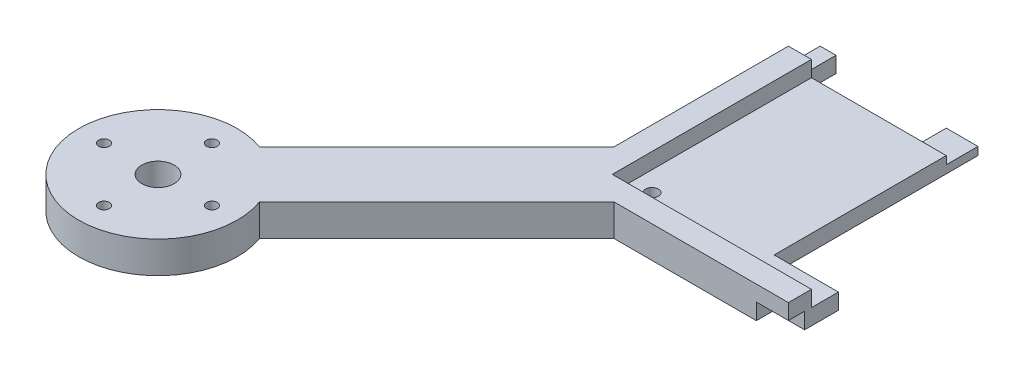
ISO-10303-21;
HEADER;
FILE_DESCRIPTION(('STEP AP214'),'2;1');
FILE_NAME('part.step','',(''),(''),'','','');
FILE_SCHEMA(('AUTOMOTIVE_DESIGN { 1 0 10303 214 1 1 1 1 }'));
ENDSEC;
DATA;
#1=APPLICATION_CONTEXT('core data for automotive mechanical design processes');
#2=APPLICATION_PROTOCOL_DEFINITION('international standard','automotive_design',2000,#1);
#3=PRODUCT_CONTEXT('',#1,'mechanical');
#4=PRODUCT('Part','Part','',(#3));
#5=PRODUCT_RELATED_PRODUCT_CATEGORY('part','',(#4));
#6=PRODUCT_DEFINITION_FORMATION('','',#4);
#7=PRODUCT_DEFINITION_CONTEXT('part definition',#1,'design');
#8=PRODUCT_DEFINITION('design','',#6,#7);
#9=PRODUCT_DEFINITION_SHAPE('','',#8);
#10=(LENGTH_UNIT() NAMED_UNIT(*) SI_UNIT(.MILLI.,.METRE.));
#11=(NAMED_UNIT(*) PLANE_ANGLE_UNIT() SI_UNIT($,.RADIAN.));
#12=(NAMED_UNIT(*) SI_UNIT($,.STERADIAN.) SOLID_ANGLE_UNIT());
#13=UNCERTAINTY_MEASURE_WITH_UNIT(LENGTH_MEASURE(1.E-05),#10,'distance_accuracy_value','');
#14=(GEOMETRIC_REPRESENTATION_CONTEXT(3) GLOBAL_UNCERTAINTY_ASSIGNED_CONTEXT((#13)) GLOBAL_UNIT_ASSIGNED_CONTEXT((#10,
#11,#12)) REPRESENTATION_CONTEXT('',''));
#15=CARTESIAN_POINT('',(0.,0.,0.));
#16=DIRECTION('',(0.,0.,1.));
#17=DIRECTION('',(1.,0.,0.));
#18=AXIS2_PLACEMENT_3D('',#15,#16,#17);
#19=CARTESIAN_POINT('',(-70.,-10.01,0.));
#20=DIRECTION('',(0.,0.,1.));
#21=DIRECTION('',(1.,0.,0.));
#22=AXIS2_PLACEMENT_3D('',#19,#20,#21);
#23=PLANE('',#22);
#24=DIRECTION('',(1.,0.,0.));
#25=VECTOR('',#24,1.);
#26=CARTESIAN_POINT('',(-70.,-5.,0.));
#27=LINE('',#26,#25);
#28=CARTESIAN_POINT('',(-70.,-5.,0.));
#29=VERTEX_POINT('',#28);
#30=CARTESIAN_POINT('',(-65.,-5.,0.));
#31=VERTEX_POINT('',#30);
#32=EDGE_CURVE('E230',#29,#31,#27,.T.);
#33=ORIENTED_EDGE('',*,*,#32,.F.);
#34=DIRECTION('',(0.,1.,0.));
#35=VECTOR('',#34,1.);
#36=CARTESIAN_POINT('',(-70.,-10.,0.));
#37=LINE('',#36,#35);
#38=CARTESIAN_POINT('',(-70.,0.,0.));
#39=VERTEX_POINT('',#38);
#40=EDGE_CURVE('E412',#29,#39,#37,.T.);
#41=ORIENTED_EDGE('',*,*,#40,.T.);
#42=DIRECTION('',(1.,0.,0.));
#43=VECTOR('',#42,1.);
#44=CARTESIAN_POINT('',(134.350288425444,0.,0.));
#45=LINE('',#44,#43);
#46=CARTESIAN_POINT('',(-62.75,0.,0.));
#47=VERTEX_POINT('',#46);
#48=EDGE_CURVE('E415',#39,#47,#45,.T.);
#49=ORIENTED_EDGE('',*,*,#48,.T.);
#50=DIRECTION('',(0.,1.,0.));
#51=VECTOR('',#50,1.);
#52=CARTESIAN_POINT('',(-62.75,-5.,0.));
#53=LINE('',#52,#51);
#54=CARTESIAN_POINT('',(-62.75,-5.,0.));
#55=VERTEX_POINT('',#54);
#56=EDGE_CURVE('E289',#55,#47,#53,.T.);
#57=ORIENTED_EDGE('',*,*,#56,.F.);
#58=DIRECTION('',(1.,0.,0.));
#59=VECTOR('',#58,1.);
#60=CARTESIAN_POINT('',(0.,-5.,0.));
#61=LINE('',#60,#59);
#62=CARTESIAN_POINT('',(-20.25,-5.,0.));
#63=VERTEX_POINT('',#62);
#64=EDGE_CURVE('E420',#55,#63,#61,.T.);
#65=ORIENTED_EDGE('',*,*,#64,.T.);
#66=DIRECTION('',(0.,1.,0.));
#67=VECTOR('',#66,1.);
#68=CARTESIAN_POINT('',(-20.25,-10.,0.));
#69=LINE('',#68,#67);
#70=CARTESIAN_POINT('',(-20.25,-7.5,0.));
#71=VERTEX_POINT('',#70);
#72=EDGE_CURVE('E285',#71,#63,#69,.T.);
#73=ORIENTED_EDGE('',*,*,#72,.F.);
#74=DIRECTION('',(1.,0.,0.));
#75=VECTOR('',#74,1.);
#76=CARTESIAN_POINT('',(-20.25,-7.5,0.));
#77=LINE('',#76,#75);
#78=CARTESIAN_POINT('',(-30.25,-7.5,0.));
#79=VERTEX_POINT('',#78);
#80=EDGE_CURVE('E250',#79,#71,#77,.T.);
#81=ORIENTED_EDGE('',*,*,#80,.F.);
#82=DIRECTION('',(0.,1.,0.));
#83=VECTOR('',#82,1.);
#84=CARTESIAN_POINT('',(-30.25,-10.,0.));
#85=LINE('',#84,#83);
#86=CARTESIAN_POINT('',(-30.25,-10.,0.));
#87=VERTEX_POINT('',#86);
#88=EDGE_CURVE('E244',#87,#79,#85,.T.);
#89=ORIENTED_EDGE('',*,*,#88,.F.);
#90=DIRECTION('',(1.,0.,0.));
#91=VECTOR('',#90,1.);
#92=CARTESIAN_POINT('',(134.350288425444,-10.,0.));
#93=LINE('',#92,#91);
#94=CARTESIAN_POINT('',(-65.,-10.,0.));
#95=VERTEX_POINT('',#94);
#96=EDGE_CURVE('E280',#95,#87,#93,.T.);
#97=ORIENTED_EDGE('',*,*,#96,.F.);
#98=DIRECTION('',(0.,-1.,0.));
#99=VECTOR('',#98,1.);
#100=CARTESIAN_POINT('',(-65.,-10.,0.));
#101=LINE('',#100,#99);
#102=EDGE_CURVE('E220',#31,#95,#101,.T.);
#103=ORIENTED_EDGE('',*,*,#102,.F.);
#104=EDGE_LOOP('',(#33,#41,#49,#57,#65,#73,#81,#89,#97,#103));
#105=FACE_BOUND('',#104,.T.);
#106=ADVANCED_FACE('F39',(#105),#23,.F.);
#107=CARTESIAN_POINT('',(0.,-10.01,-70.));
#108=DIRECTION('',(-1.,0.,0.));
#109=DIRECTION('',(0.,0.,1.));
#110=AXIS2_PLACEMENT_3D('',#107,#108,#109);
#111=PLANE('',#110);
#112=DIRECTION('',(0.,-1.,0.));
#113=VECTOR('',#112,1.);
#114=CARTESIAN_POINT('',(0.,-10.,70.));
#115=LINE('',#114,#113);
#116=CARTESIAN_POINT('',(0.,0.,70.));
#117=VERTEX_POINT('',#116);
#118=CARTESIAN_POINT('',(0.,-4.9,70.));
#119=VERTEX_POINT('',#118);
#120=EDGE_CURVE('E286',#117,#119,#115,.T.);
#121=ORIENTED_EDGE('',*,*,#120,.T.);
#122=DIRECTION('',(0.,0.,1.));
#123=VECTOR('',#122,1.);
#124=CARTESIAN_POINT('',(0.,-4.9,70.));
#125=LINE('',#124,#123);
#126=CARTESIAN_POINT('',(0.,-4.9,64.9));
#127=VERTEX_POINT('',#126);
#128=EDGE_CURVE('E459',#127,#119,#125,.T.);
#129=ORIENTED_EDGE('',*,*,#128,.F.);
#130=DIRECTION('',(0.,1.,0.));
#131=VECTOR('',#130,1.);
#132=CARTESIAN_POINT('',(0.,-10.,64.9));
#133=LINE('',#132,#131);
#134=CARTESIAN_POINT('',(0.,-10.,64.9));
#135=VERTEX_POINT('',#134);
#136=EDGE_CURVE('E462',#135,#127,#133,.T.);
#137=ORIENTED_EDGE('',*,*,#136,.F.);
#138=DIRECTION('',(0.,0.,1.));
#139=VECTOR('',#138,1.);
#140=CARTESIAN_POINT('',(0.,-10.,-134.350288425444));
#141=LINE('',#140,#139);
#142=CARTESIAN_POINT('',(0.,-10.,54.25));
#143=VERTEX_POINT('',#142);
#144=EDGE_CURVE('E205',#143,#135,#141,.T.);
#145=ORIENTED_EDGE('',*,*,#144,.F.);
#146=DIRECTION('',(0.,-1.,0.));
#147=VECTOR('',#146,1.);
#148=CARTESIAN_POINT('',(0.,-10.,54.25));
#149=LINE('',#148,#147);
#150=CARTESIAN_POINT('',(0.,-5.,54.25));
#151=VERTEX_POINT('',#150);
#152=EDGE_CURVE('E281',#151,#143,#149,.T.);
#153=ORIENTED_EDGE('',*,*,#152,.F.);
#154=DIRECTION('',(0.,0.,1.));
#155=VECTOR('',#154,1.);
#156=CARTESIAN_POINT('',(0.,-5.,0.));
#157=LINE('',#156,#155);
#158=CARTESIAN_POINT('',(0.,-5.,62.75));
#159=VERTEX_POINT('',#158);
#160=EDGE_CURVE('E42',#151,#159,#157,.T.);
#161=ORIENTED_EDGE('',*,*,#160,.T.);
#162=DIRECTION('',(0.,-1.,0.));
#163=VECTOR('',#162,1.);
#164=CARTESIAN_POINT('',(0.,-5.,62.75));
#165=LINE('',#164,#163);
#166=CARTESIAN_POINT('',(0.,0.,62.75));
#167=VERTEX_POINT('',#166);
#168=EDGE_CURVE('E279',#167,#159,#165,.T.);
#169=ORIENTED_EDGE('',*,*,#168,.F.);
#170=DIRECTION('',(0.,0.,1.));
#171=VECTOR('',#170,1.);
#172=CARTESIAN_POINT('',(0.,0.,-134.350288425444));
#173=LINE('',#172,#171);
#174=EDGE_CURVE('E419',#167,#117,#173,.T.);
#175=ORIENTED_EDGE('',*,*,#174,.T.);
#176=EDGE_LOOP('',(#121,#129,#137,#145,#153,#161,#169,#175));
#177=FACE_BOUND('',#176,.T.);
#178=ADVANCED_FACE('F443',(#177),#111,.F.);
#179=CARTESIAN_POINT('',(-134.350288425444,-10.,117.350288425444));
#180=DIRECTION('',(0.,1.,0.));
#181=DIRECTION('',(0.,0.,1.));
#182=AXIS2_PLACEMENT_3D('',#179,#180,#181);
#183=CYLINDRICAL_SURFACE('',#182,1.70000000000001);
#184=CARTESIAN_POINT('',(-134.350288425444,-10.,117.350288425444));
#185=DIRECTION('',(0.,1.,0.));
#186=DIRECTION('',(0.,0.,1.));
#187=AXIS2_PLACEMENT_3D('',#184,#185,#186);
#188=CIRCLE('',#187,1.70000000000001);
#189=CARTESIAN_POINT('',(-134.350288425444,-10.,119.050288425444));
#190=VERTEX_POINT('',#189);
#191=EDGE_CURVE('E348',#190,#190,#188,.T.);
#192=ORIENTED_EDGE('',*,*,#191,.F.);
#193=EDGE_LOOP('',(#192));
#194=FACE_BOUND('',#193,.T.);
#195=CARTESIAN_POINT('',(-134.350288425444,0.,117.350288425444));
#196=DIRECTION('',(0.,1.,0.));
#197=DIRECTION('',(0.,0.,1.));
#198=AXIS2_PLACEMENT_3D('',#195,#196,#197);
#199=CIRCLE('',#198,1.70000000000001);
#200=CARTESIAN_POINT('',(-134.350288425444,0.,119.050288425444));
#201=VERTEX_POINT('',#200);
#202=EDGE_CURVE('E349',#201,#201,#199,.T.);
#203=ORIENTED_EDGE('',*,*,#202,.T.);
#204=EDGE_LOOP('',(#203));
#205=FACE_BOUND('',#204,.T.);
#206=ADVANCED_FACE('F484',(#194,#205),#183,.F.);
#207=CARTESIAN_POINT('',(-117.350288425444,-10.,134.350288425444));
#208=DIRECTION('',(0.,1.,0.));
#209=DIRECTION('',(0.,0.,1.));
#210=AXIS2_PLACEMENT_3D('',#207,#208,#209);
#211=CYLINDRICAL_SURFACE('',#210,1.7);
#212=CARTESIAN_POINT('',(-117.350288425444,-10.,134.350288425444));
#213=DIRECTION('',(0.,1.,0.));
#214=DIRECTION('',(0.,0.,1.));
#215=AXIS2_PLACEMENT_3D('',#212,#213,#214);
#216=CIRCLE('',#215,1.7);
#217=CARTESIAN_POINT('',(-117.350288425444,-10.,136.050288425444));
#218=VERTEX_POINT('',#217);
#219=EDGE_CURVE('E353',#218,#218,#216,.T.);
#220=ORIENTED_EDGE('',*,*,#219,.F.);
#221=EDGE_LOOP('',(#220));
#222=FACE_BOUND('',#221,.T.);
#223=CARTESIAN_POINT('',(-117.350288425444,0.,134.350288425444));
#224=DIRECTION('',(0.,1.,0.));
#225=DIRECTION('',(0.,0.,1.));
#226=AXIS2_PLACEMENT_3D('',#223,#224,#225);
#227=CIRCLE('',#226,1.7);
#228=CARTESIAN_POINT('',(-117.350288425444,0.,136.050288425444));
#229=VERTEX_POINT('',#228);
#230=EDGE_CURVE('E357',#229,#229,#227,.T.);
#231=ORIENTED_EDGE('',*,*,#230,.T.);
#232=EDGE_LOOP('',(#231));
#233=FACE_BOUND('',#232,.T.);
#234=ADVANCED_FACE('F542',(#222,#233),#211,.F.);
#235=CARTESIAN_POINT('',(-151.350288425444,-10.,134.350288425444));
#236=DIRECTION('',(0.,1.,0.));
#237=DIRECTION('',(0.,0.,1.));
#238=AXIS2_PLACEMENT_3D('',#235,#236,#237);
#239=CYLINDRICAL_SURFACE('',#238,1.70000000000001);
#240=CARTESIAN_POINT('',(-151.350288425444,-10.,134.350288425444));
#241=DIRECTION('',(0.,1.,0.));
#242=DIRECTION('',(0.,0.,1.));
#243=AXIS2_PLACEMENT_3D('',#240,#241,#242);
#244=CIRCLE('',#243,1.70000000000001);
#245=CARTESIAN_POINT('',(-151.350288425444,-10.,136.050288425444));
#246=VERTEX_POINT('',#245);
#247=EDGE_CURVE('E361',#246,#246,#244,.T.);
#248=ORIENTED_EDGE('',*,*,#247,.F.);
#249=EDGE_LOOP('',(#248));
#250=FACE_BOUND('',#249,.T.);
#251=CARTESIAN_POINT('',(-151.350288425444,0.,134.350288425444));
#252=DIRECTION('',(0.,1.,0.));
#253=DIRECTION('',(0.,0.,1.));
#254=AXIS2_PLACEMENT_3D('',#251,#252,#253);
#255=CIRCLE('',#254,1.70000000000001);
#256=CARTESIAN_POINT('',(-151.350288425444,0.,136.050288425444));
#257=VERTEX_POINT('',#256);
#258=EDGE_CURVE('E365',#257,#257,#255,.T.);
#259=ORIENTED_EDGE('',*,*,#258,.T.);
#260=EDGE_LOOP('',(#259));
#261=FACE_BOUND('',#260,.T.);
#262=ADVANCED_FACE('F548',(#250,#261),#239,.F.);
#263=CARTESIAN_POINT('',(-134.350288425444,-10.,151.350288425444));
#264=DIRECTION('',(0.,1.,0.));
#265=DIRECTION('',(0.,0.,1.));
#266=AXIS2_PLACEMENT_3D('',#263,#264,#265);
#267=CYLINDRICAL_SURFACE('',#266,1.70000000000001);
#268=CARTESIAN_POINT('',(-134.350288425444,-10.,151.350288425444));
#269=DIRECTION('',(0.,1.,0.));
#270=DIRECTION('',(0.,0.,1.));
#271=AXIS2_PLACEMENT_3D('',#268,#269,#270);
#272=CIRCLE('',#271,1.70000000000001);
#273=CARTESIAN_POINT('',(-134.350288425444,-10.,153.050288425444));
#274=VERTEX_POINT('',#273);
#275=EDGE_CURVE('E369',#274,#274,#272,.T.);
#276=ORIENTED_EDGE('',*,*,#275,.F.);
#277=EDGE_LOOP('',(#276));
#278=FACE_BOUND('',#277,.T.);
#279=CARTESIAN_POINT('',(-134.350288425444,0.,151.350288425444));
#280=DIRECTION('',(0.,1.,0.));
#281=DIRECTION('',(0.,0.,1.));
#282=AXIS2_PLACEMENT_3D('',#279,#280,#281);
#283=CIRCLE('',#282,1.70000000000001);
#284=CARTESIAN_POINT('',(-134.350288425444,0.,153.050288425444));
#285=VERTEX_POINT('',#284);
#286=EDGE_CURVE('E373',#285,#285,#283,.T.);
#287=ORIENTED_EDGE('',*,*,#286,.T.);
#288=EDGE_LOOP('',(#287));
#289=FACE_BOUND('',#288,.T.);
#290=ADVANCED_FACE('F559',(#278,#289),#267,.F.);
#291=CARTESIAN_POINT('',(-134.350288425444,-10.,134.350288425444));
#292=DIRECTION('',(0.,1.,0.));
#293=DIRECTION('',(0.,0.,1.));
#294=AXIS2_PLACEMENT_3D('',#291,#292,#293);
#295=CYLINDRICAL_SURFACE('',#294,5.10000000000065);
#296=CARTESIAN_POINT('',(-134.350288425444,-10.,134.350288425444));
#297=DIRECTION('',(0.,1.,0.));
#298=DIRECTION('',(0.,0.,1.));
#299=AXIS2_PLACEMENT_3D('',#296,#297,#298);
#300=CIRCLE('',#299,5.10000000000065);
#301=CARTESIAN_POINT('',(-134.350288425444,-10.,139.450288425445));
#302=VERTEX_POINT('',#301);
#303=EDGE_CURVE('E377',#302,#302,#300,.T.);
#304=ORIENTED_EDGE('',*,*,#303,.F.);
#305=EDGE_LOOP('',(#304));
#306=FACE_BOUND('',#305,.T.);
#307=CARTESIAN_POINT('',(-134.350288425444,0.,134.350288425444));
#308=DIRECTION('',(0.,1.,0.));
#309=DIRECTION('',(0.,0.,1.));
#310=AXIS2_PLACEMENT_3D('',#307,#308,#309);
#311=CIRCLE('',#310,5.10000000000065);
#312=CARTESIAN_POINT('',(-134.350288425444,0.,139.450288425445));
#313=VERTEX_POINT('',#312);
#314=EDGE_CURVE('E381',#313,#313,#311,.T.);
#315=ORIENTED_EDGE('',*,*,#314,.T.);
#316=EDGE_LOOP('',(#315));
#317=FACE_BOUND('',#316,.T.);
#318=ADVANCED_FACE('F563',(#306,#317),#295,.F.);
#319=CARTESIAN_POINT('',(-55.,-10.,70.));
#320=DIRECTION('',(0.,0.,1.));
#321=DIRECTION('',(1.,0.,0.));
#322=AXIS2_PLACEMENT_3D('',#319,#320,#321);
#323=PLANE('',#322);
#324=DIRECTION('',(1.,0.,0.));
#325=VECTOR('',#324,1.);
#326=CARTESIAN_POINT('',(-10.1,-4.9,70.));
#327=LINE('',#326,#325);
#328=CARTESIAN_POINT('',(-10.1,-4.9,70.));
#329=VERTEX_POINT('',#328);
#330=EDGE_CURVE('E210',#329,#119,#327,.T.);
#331=ORIENTED_EDGE('',*,*,#330,.T.);
#332=ORIENTED_EDGE('',*,*,#120,.F.);
#333=DIRECTION('',(1.,0.,0.));
#334=VECTOR('',#333,1.);
#335=CARTESIAN_POINT('',(-55.,0.,70.));
#336=LINE('',#335,#334);
#337=CARTESIAN_POINT('',(-55.,0.,70.));
#338=VERTEX_POINT('',#337);
#339=EDGE_CURVE('E304',#338,#117,#336,.T.);
#340=ORIENTED_EDGE('',*,*,#339,.F.);
#341=DIRECTION('',(0.,1.,0.));
#342=VECTOR('',#341,1.);
#343=CARTESIAN_POINT('',(-55.,-10.,70.));
#344=LINE('',#343,#342);
#345=CARTESIAN_POINT('',(-55.,-10.,70.));
#346=VERTEX_POINT('',#345);
#347=EDGE_CURVE('E301',#346,#338,#344,.T.);
#348=ORIENTED_EDGE('',*,*,#347,.F.);
#349=DIRECTION('',(1.,0.,0.));
#350=VECTOR('',#349,1.);
#351=CARTESIAN_POINT('',(-55.,-10.,70.));
#352=LINE('',#351,#350);
#353=CARTESIAN_POINT('',(-10.1,-10.,70.));
#354=VERTEX_POINT('',#353);
#355=EDGE_CURVE('E294',#346,#354,#352,.T.);
#356=ORIENTED_EDGE('',*,*,#355,.T.);
#357=DIRECTION('',(0.,-1.,0.));
#358=VECTOR('',#357,1.);
#359=CARTESIAN_POINT('',(-10.1,-10.,70.));
#360=LINE('',#359,#358);
#361=EDGE_CURVE('E56',#329,#354,#360,.T.);
#362=ORIENTED_EDGE('',*,*,#361,.F.);
#363=EDGE_LOOP('',(#331,#332,#340,#348,#356,#362));
#364=FACE_BOUND('',#363,.T.);
#365=ADVANCED_FACE('F455',(#364),#323,.T.);
#366=CARTESIAN_POINT('',(-55.,-10.,70.));
#367=DIRECTION('',(0.707106781186547,0.,0.707106781186548));
#368=DIRECTION('',(0.707106781186548,0.,-0.707106781186547));
#369=AXIS2_PLACEMENT_3D('',#366,#367,#368);
#370=PLANE('',#369);
#371=DIRECTION('',(0.707106781186548,0.,-0.707106781186547));
#372=VECTOR('',#371,1.);
#373=CARTESIAN_POINT('',(-55.,0.,70.));
#374=LINE('',#373,#372);
#375=CARTESIAN_POINT('',(-110.842477831862,0.,125.842477831862));
#376=VERTEX_POINT('',#375);
#377=EDGE_CURVE('E308',#376,#338,#374,.T.);
#378=ORIENTED_EDGE('',*,*,#377,.F.);
#379=DIRECTION('',(0.,1.,0.));
#380=VECTOR('',#379,1.);
#381=CARTESIAN_POINT('',(-110.842477831862,-10.,125.842477831862));
#382=LINE('',#381,#380);
#383=CARTESIAN_POINT('',(-110.842477831862,-10.,125.842477831862));
#384=VERTEX_POINT('',#383);
#385=EDGE_CURVE('E298',#384,#376,#382,.T.);
#386=ORIENTED_EDGE('',*,*,#385,.F.);
#387=DIRECTION('',(0.707106781186548,0.,-0.707106781186547));
#388=VECTOR('',#387,1.);
#389=CARTESIAN_POINT('',(-55.,-10.,70.));
#390=LINE('',#389,#388);
#391=EDGE_CURVE('E324',#384,#346,#390,.T.);
#392=ORIENTED_EDGE('',*,*,#391,.T.);
#393=ORIENTED_EDGE('',*,*,#347,.T.);
#394=EDGE_LOOP('',(#378,#386,#392,#393));
#395=FACE_BOUND('',#394,.T.);
#396=ADVANCED_FACE('F725',(#395),#370,.T.);
#397=CARTESIAN_POINT('',(-134.350288425444,-10.,134.350288425444));
#398=DIRECTION('',(0.,1.,0.));
#399=DIRECTION('',(0.,0.,1.));
#400=AXIS2_PLACEMENT_3D('',#397,#398,#399);
#401=CYLINDRICAL_SURFACE('',#400,25.);
#402=CARTESIAN_POINT('',(-134.350288425444,0.,134.350288425444));
#403=DIRECTION('',(0.,1.,0.));
#404=DIRECTION('',(0.,0.,1.));
#405=AXIS2_PLACEMENT_3D('',#402,#403,#404);
#406=CIRCLE('',#405,25.);
#407=CARTESIAN_POINT('',(-125.842477831862,0.,110.842477831862));
#408=VERTEX_POINT('',#407);
#409=EDGE_CURVE('E313',#408,#376,#406,.T.);
#410=ORIENTED_EDGE('',*,*,#409,.F.);
#411=DIRECTION('',(0.,1.,0.));
#412=VECTOR('',#411,1.);
#413=CARTESIAN_POINT('',(-125.842477831862,-10.,110.842477831862));
#414=LINE('',#413,#412);
#415=CARTESIAN_POINT('',(-125.842477831862,-10.,110.842477831862));
#416=VERTEX_POINT('',#415);
#417=EDGE_CURVE('E295',#416,#408,#414,.T.);
#418=ORIENTED_EDGE('',*,*,#417,.F.);
#419=CARTESIAN_POINT('',(-134.350288425444,-10.,134.350288425444));
#420=DIRECTION('',(0.,1.,0.));
#421=DIRECTION('',(0.,0.,1.));
#422=AXIS2_PLACEMENT_3D('',#419,#420,#421);
#423=CIRCLE('',#422,25.);
#424=EDGE_CURVE('E328',#416,#384,#423,.T.);
#425=ORIENTED_EDGE('',*,*,#424,.T.);
#426=ORIENTED_EDGE('',*,*,#385,.T.);
#427=EDGE_LOOP('',(#410,#418,#425,#426));
#428=FACE_BOUND('',#427,.T.);
#429=ADVANCED_FACE('F717',(#428),#401,.T.);
#430=CARTESIAN_POINT('',(-70.,-10.,55.));
#431=DIRECTION('',(-0.707106781186548,0.,-0.707106781186547));
#432=DIRECTION('',(-0.707106781186547,0.,0.707106781186548));
#433=AXIS2_PLACEMENT_3D('',#430,#431,#432);
#434=PLANE('',#433);
#435=DIRECTION('',(-0.707106781186547,0.,0.707106781186548));
#436=VECTOR('',#435,1.);
#437=CARTESIAN_POINT('',(-70.,0.,55.));
#438=LINE('',#437,#436);
#439=CARTESIAN_POINT('',(-70.,0.,55.));
#440=VERTEX_POINT('',#439);
#441=EDGE_CURVE('E317',#440,#408,#438,.T.);
#442=ORIENTED_EDGE('',*,*,#441,.F.);
#443=DIRECTION('',(0.,1.,0.));
#444=VECTOR('',#443,1.);
#445=CARTESIAN_POINT('',(-70.,-10.,55.));
#446=LINE('',#445,#444);
#447=CARTESIAN_POINT('',(-70.,-10.,55.));
#448=VERTEX_POINT('',#447);
#449=EDGE_CURVE('E290',#448,#440,#446,.T.);
#450=ORIENTED_EDGE('',*,*,#449,.F.);
#451=DIRECTION('',(-0.707106781186547,0.,0.707106781186548));
#452=VECTOR('',#451,1.);
#453=CARTESIAN_POINT('',(-70.,-10.,55.));
#454=LINE('',#453,#452);
#455=EDGE_CURVE('E332',#448,#416,#454,.T.);
#456=ORIENTED_EDGE('',*,*,#455,.T.);
#457=ORIENTED_EDGE('',*,*,#417,.T.);
#458=EDGE_LOOP('',(#442,#450,#456,#457));
#459=FACE_BOUND('',#458,.T.);
#460=ADVANCED_FACE('F574',(#459),#434,.T.);
#461=CARTESIAN_POINT('',(-70.,-10.,-55.));
#462=DIRECTION('',(-1.,0.,0.));
#463=DIRECTION('',(0.,0.,1.));
#464=AXIS2_PLACEMENT_3D('',#461,#462,#463);
#465=PLANE('',#464);
#466=ORIENTED_EDGE('',*,*,#40,.F.);
#467=DIRECTION('',(0.,0.,1.));
#468=VECTOR('',#467,1.);
#469=CARTESIAN_POINT('',(-70.,-5.,-10.));
#470=LINE('',#469,#468);
#471=CARTESIAN_POINT('',(-70.,-5.,-10.));
#472=VERTEX_POINT('',#471);
#473=EDGE_CURVE('E241',#472,#29,#470,.T.);
#474=ORIENTED_EDGE('',*,*,#473,.F.);
#475=DIRECTION('',(0.,1.,0.));
#476=VECTOR('',#475,1.);
#477=CARTESIAN_POINT('',(-70.,-10.,-10.));
#478=LINE('',#477,#476);
#479=CARTESIAN_POINT('',(-70.,-10.,-10.));
#480=VERTEX_POINT('',#479);
#481=EDGE_CURVE('E215',#480,#472,#478,.T.);
#482=ORIENTED_EDGE('',*,*,#481,.F.);
#483=DIRECTION('',(0.,0.,1.));
#484=VECTOR('',#483,1.);
#485=CARTESIAN_POINT('',(-70.,-10.,-55.));
#486=LINE('',#485,#484);
#487=EDGE_CURVE('E309',#480,#448,#486,.T.);
#488=ORIENTED_EDGE('',*,*,#487,.T.);
#489=ORIENTED_EDGE('',*,*,#449,.T.);
#490=DIRECTION('',(0.,0.,1.));
#491=VECTOR('',#490,1.);
#492=CARTESIAN_POINT('',(-70.,0.,-55.));
#493=LINE('',#492,#491);
#494=EDGE_CURVE('E321',#39,#440,#493,.T.);
#495=ORIENTED_EDGE('',*,*,#494,.F.);
#496=EDGE_LOOP('',(#466,#474,#482,#488,#489,#495));
#497=FACE_BOUND('',#496,.T.);
#498=ADVANCED_FACE('F495',(#497),#465,.T.);
#499=CARTESIAN_POINT('',(-56.5,-10.,56.5000000000001));
#500=DIRECTION('',(0.,1.,0.));
#501=DIRECTION('',(0.,0.,1.));
#502=AXIS2_PLACEMENT_3D('',#499,#500,#501);
#503=CYLINDRICAL_SURFACE('',#502,2.);
#504=CARTESIAN_POINT('',(-56.5,-10.,56.5000000000001));
#505=DIRECTION('',(0.,1.,0.));
#506=DIRECTION('',(0.,0.,1.));
#507=AXIS2_PLACEMENT_3D('',#504,#505,#506);
#508=CIRCLE('',#507,2.);
#509=CARTESIAN_POINT('',(-56.5,-10.,58.5000000000001));
#510=VERTEX_POINT('',#509);
#511=EDGE_CURVE('E344',#510,#510,#508,.T.);
#512=ORIENTED_EDGE('',*,*,#511,.F.);
#513=EDGE_LOOP('',(#512));
#514=FACE_BOUND('',#513,.T.);
#515=CARTESIAN_POINT('',(-56.5,-5.,56.5000000000001));
#516=DIRECTION('',(0.,1.,0.));
#517=DIRECTION('',(0.,0.,1.));
#518=AXIS2_PLACEMENT_3D('',#515,#516,#517);
#519=CIRCLE('',#518,2.);
#520=CARTESIAN_POINT('',(-56.5,-5.,58.5000000000001));
#521=VERTEX_POINT('',#520);
#522=EDGE_CURVE('E389',#521,#521,#519,.F.);
#523=ORIENTED_EDGE('',*,*,#522,.F.);
#524=EDGE_LOOP('',(#523));
#525=FACE_BOUND('',#524,.T.);
#526=ADVANCED_FACE('F554',(#514,#525),#503,.F.);
#527=CARTESIAN_POINT('',(-20.25,-10.,-54.25));
#528=DIRECTION('',(-1.,0.,0.));
#529=DIRECTION('',(0.,0.,1.));
#530=AXIS2_PLACEMENT_3D('',#527,#528,#529);
#531=PLANE('',#530);
#532=DIRECTION('',(0.,0.,1.));
#533=VECTOR('',#532,1.);
#534=CARTESIAN_POINT('',(-20.25,-10.,-54.25));
#535=LINE('',#534,#533);
#536=CARTESIAN_POINT('',(-20.25,-10.,-10.));
#537=VERTEX_POINT('',#536);
#538=CARTESIAN_POINT('',(-20.25,-10.,54.25));
#539=VERTEX_POINT('',#538);
#540=EDGE_CURVE('E343',#537,#539,#535,.T.);
#541=ORIENTED_EDGE('',*,*,#540,.F.);
#542=DIRECTION('',(0.,-1.,0.));
#543=VECTOR('',#542,1.);
#544=CARTESIAN_POINT('',(-20.25,-10.,-10.));
#545=LINE('',#544,#543);
#546=CARTESIAN_POINT('',(-20.25,-7.5,-10.));
#547=VERTEX_POINT('',#546);
#548=EDGE_CURVE('E245',#547,#537,#545,.T.);
#549=ORIENTED_EDGE('',*,*,#548,.F.);
#550=DIRECTION('',(0.,0.,1.));
#551=VECTOR('',#550,1.);
#552=CARTESIAN_POINT('',(-20.25,-7.5,-10.));
#553=LINE('',#552,#551);
#554=EDGE_CURVE('E259',#547,#71,#553,.T.);
#555=ORIENTED_EDGE('',*,*,#554,.T.);
#556=ORIENTED_EDGE('',*,*,#72,.T.);
#557=DIRECTION('',(0.,0.,-1.));
#558=VECTOR('',#557,1.);
#559=CARTESIAN_POINT('',(-20.25,-5.,-54.25));
#560=LINE('',#559,#558);
#561=CARTESIAN_POINT('',(-20.25,-5.,54.25));
#562=VERTEX_POINT('',#561);
#563=EDGE_CURVE('E394',#562,#63,#560,.T.);
#564=ORIENTED_EDGE('',*,*,#563,.F.);
#565=DIRECTION('',(0.,1.,0.));
#566=VECTOR('',#565,1.);
#567=CARTESIAN_POINT('',(-20.25,-10.,54.25));
#568=LINE('',#567,#566);
#569=EDGE_CURVE('E336',#539,#562,#568,.T.);
#570=ORIENTED_EDGE('',*,*,#569,.F.);
#571=EDGE_LOOP('',(#541,#549,#555,#556,#564,#570));
#572=FACE_BOUND('',#571,.T.);
#573=ADVANCED_FACE('F513',(#572),#531,.F.);
#574=CARTESIAN_POINT('',(-20.25,-10.,54.25));
#575=DIRECTION('',(0.,0.,1.));
#576=DIRECTION('',(1.,0.,0.));
#577=AXIS2_PLACEMENT_3D('',#574,#575,#576);
#578=PLANE('',#577);
#579=DIRECTION('',(-1.,0.,0.));
#580=VECTOR('',#579,1.);
#581=CARTESIAN_POINT('',(-20.25,-5.,54.25));
#582=LINE('',#581,#580);
#583=EDGE_CURVE('E385',#151,#562,#582,.T.);
#584=ORIENTED_EDGE('',*,*,#583,.F.);
#585=ORIENTED_EDGE('',*,*,#152,.T.);
#586=DIRECTION('',(1.,0.,0.));
#587=VECTOR('',#586,1.);
#588=CARTESIAN_POINT('',(-20.25,-10.,54.25));
#589=LINE('',#588,#587);
#590=EDGE_CURVE('E340',#539,#143,#589,.T.);
#591=ORIENTED_EDGE('',*,*,#590,.F.);
#592=ORIENTED_EDGE('',*,*,#569,.T.);
#593=EDGE_LOOP('',(#584,#585,#591,#592));
#594=FACE_BOUND('',#593,.T.);
#595=ADVANCED_FACE('F516',(#594),#578,.F.);
#596=CARTESIAN_POINT('',(-62.75,-5.,62.75));
#597=DIRECTION('',(0.,0.,1.));
#598=DIRECTION('',(1.,0.,0.));
#599=AXIS2_PLACEMENT_3D('',#596,#597,#598);
#600=PLANE('',#599);
#601=DIRECTION('',(1.,0.,0.));
#602=VECTOR('',#601,1.);
#603=CARTESIAN_POINT('',(-62.75,0.,62.75));
#604=LINE('',#603,#602);
#605=CARTESIAN_POINT('',(-62.75,0.,62.75));
#606=VERTEX_POINT('',#605);
#607=EDGE_CURVE('E48',#606,#167,#604,.T.);
#608=ORIENTED_EDGE('',*,*,#607,.T.);
#609=ORIENTED_EDGE('',*,*,#168,.T.);
#610=DIRECTION('',(1.,0.,0.));
#611=VECTOR('',#610,1.);
#612=CARTESIAN_POINT('',(-62.75,-5.,62.75));
#613=LINE('',#612,#611);
#614=CARTESIAN_POINT('',(-62.75,-5.,62.75));
#615=VERTEX_POINT('',#614);
#616=EDGE_CURVE('E398',#615,#159,#613,.T.);
#617=ORIENTED_EDGE('',*,*,#616,.F.);
#618=DIRECTION('',(0.,1.,0.));
#619=VECTOR('',#618,1.);
#620=CARTESIAN_POINT('',(-62.75,-5.,62.75));
#621=LINE('',#620,#619);
#622=EDGE_CURVE('E393',#615,#606,#621,.T.);
#623=ORIENTED_EDGE('',*,*,#622,.T.);
#624=EDGE_LOOP('',(#608,#609,#617,#623));
#625=FACE_BOUND('',#624,.T.);
#626=ADVANCED_FACE('F568',(#625),#600,.F.);
#627=CARTESIAN_POINT('',(134.350288425444,0.,-134.350288425444));
#628=DIRECTION('',(0.,1.,0.));
#629=DIRECTION('',(0.,0.,1.));
#630=AXIS2_PLACEMENT_3D('',#627,#628,#629);
#631=PLANE('',#630);
#632=ORIENTED_EDGE('',*,*,#48,.F.);
#633=ORIENTED_EDGE('',*,*,#494,.T.);
#634=ORIENTED_EDGE('',*,*,#441,.T.);
#635=ORIENTED_EDGE('',*,*,#409,.T.);
#636=ORIENTED_EDGE('',*,*,#377,.T.);
#637=ORIENTED_EDGE('',*,*,#339,.T.);
#638=ORIENTED_EDGE('',*,*,#174,.F.);
#639=ORIENTED_EDGE('',*,*,#607,.F.);
#640=DIRECTION('',(0.,0.,1.));
#641=VECTOR('',#640,1.);
#642=CARTESIAN_POINT('',(-62.75,0.,-62.75));
#643=LINE('',#642,#641);
#644=EDGE_CURVE('E11',#47,#606,#643,.T.);
#645=ORIENTED_EDGE('',*,*,#644,.F.);
#646=EDGE_LOOP('',(#632,#633,#634,#635,#636,#637,#638,#639,#645));
#647=FACE_BOUND('',#646,.T.);
#648=ORIENTED_EDGE('',*,*,#314,.F.);
#649=EDGE_LOOP('',(#648));
#650=FACE_BOUND('',#649,.T.);
#651=ORIENTED_EDGE('',*,*,#286,.F.);
#652=EDGE_LOOP('',(#651));
#653=FACE_BOUND('',#652,.T.);
#654=ORIENTED_EDGE('',*,*,#258,.F.);
#655=EDGE_LOOP('',(#654));
#656=FACE_BOUND('',#655,.T.);
#657=ORIENTED_EDGE('',*,*,#230,.F.);
#658=EDGE_LOOP('',(#657));
#659=FACE_BOUND('',#658,.T.);
#660=ORIENTED_EDGE('',*,*,#202,.F.);
#661=EDGE_LOOP('',(#660));
#662=FACE_BOUND('',#661,.T.);
#663=ADVANCED_FACE('F450',(#647,#650,#653,#656,#659,#662),#631,.T.);
#664=CARTESIAN_POINT('',(0.,-5.,0.));
#665=DIRECTION('',(0.,1.,0.));
#666=DIRECTION('',(0.,0.,1.));
#667=AXIS2_PLACEMENT_3D('',#664,#665,#666);
#668=PLANE('',#667);
#669=ORIENTED_EDGE('',*,*,#64,.F.);
#670=DIRECTION('',(0.,0.,1.));
#671=VECTOR('',#670,1.);
#672=CARTESIAN_POINT('',(-62.75,-5.,-62.75));
#673=LINE('',#672,#671);
#674=EDGE_CURVE('E402',#55,#615,#673,.T.);
#675=ORIENTED_EDGE('',*,*,#674,.T.);
#676=ORIENTED_EDGE('',*,*,#616,.T.);
#677=ORIENTED_EDGE('',*,*,#160,.F.);
#678=ORIENTED_EDGE('',*,*,#583,.T.);
#679=ORIENTED_EDGE('',*,*,#563,.T.);
#680=EDGE_LOOP('',(#669,#675,#676,#677,#678,#679));
#681=FACE_BOUND('',#680,.T.);
#682=ORIENTED_EDGE('',*,*,#522,.T.);
#683=EDGE_LOOP('',(#682));
#684=FACE_BOUND('',#683,.T.);
#685=ADVANCED_FACE('F507',(#681,#684),#668,.T.);
#686=CARTESIAN_POINT('',(-62.75,-5.,-62.75));
#687=DIRECTION('',(-1.,0.,0.));
#688=DIRECTION('',(0.,0.,1.));
#689=AXIS2_PLACEMENT_3D('',#686,#687,#688);
#690=PLANE('',#689);
#691=ORIENTED_EDGE('',*,*,#674,.F.);
#692=ORIENTED_EDGE('',*,*,#56,.T.);
#693=ORIENTED_EDGE('',*,*,#644,.T.);
#694=ORIENTED_EDGE('',*,*,#622,.F.);
#695=EDGE_LOOP('',(#691,#692,#693,#694));
#696=FACE_BOUND('',#695,.T.);
#697=ADVANCED_FACE('F504',(#696),#690,.F.);
#698=CARTESIAN_POINT('',(134.350288425444,-10.,-134.350288425444));
#699=DIRECTION('',(0.,1.,0.));
#700=DIRECTION('',(0.,0.,1.));
#701=AXIS2_PLACEMENT_3D('',#698,#699,#700);
#702=PLANE('',#701);
#703=ORIENTED_EDGE('',*,*,#303,.T.);
#704=EDGE_LOOP('',(#703));
#705=FACE_BOUND('',#704,.T.);
#706=ORIENTED_EDGE('',*,*,#275,.T.);
#707=EDGE_LOOP('',(#706));
#708=FACE_BOUND('',#707,.T.);
#709=ORIENTED_EDGE('',*,*,#247,.T.);
#710=EDGE_LOOP('',(#709));
#711=FACE_BOUND('',#710,.T.);
#712=ORIENTED_EDGE('',*,*,#219,.T.);
#713=EDGE_LOOP('',(#712));
#714=FACE_BOUND('',#713,.T.);
#715=ORIENTED_EDGE('',*,*,#191,.T.);
#716=EDGE_LOOP('',(#715));
#717=FACE_BOUND('',#716,.T.);
#718=ORIENTED_EDGE('',*,*,#511,.T.);
#719=EDGE_LOOP('',(#718));
#720=FACE_BOUND('',#719,.T.);
#721=ORIENTED_EDGE('',*,*,#144,.T.);
#722=DIRECTION('',(1.,0.,0.));
#723=VECTOR('',#722,1.);
#724=CARTESIAN_POINT('',(-10.1,-10.,64.9));
#725=LINE('',#724,#723);
#726=CARTESIAN_POINT('',(-10.1,-10.,64.9));
#727=VERTEX_POINT('',#726);
#728=EDGE_CURVE('E189',#727,#135,#725,.T.);
#729=ORIENTED_EDGE('',*,*,#728,.F.);
#730=DIRECTION('',(0.,0.,-1.));
#731=VECTOR('',#730,1.);
#732=CARTESIAN_POINT('',(-10.1,-10.,70.));
#733=LINE('',#732,#731);
#734=EDGE_CURVE('E195',#354,#727,#733,.T.);
#735=ORIENTED_EDGE('',*,*,#734,.F.);
#736=ORIENTED_EDGE('',*,*,#355,.F.);
#737=ORIENTED_EDGE('',*,*,#391,.F.);
#738=ORIENTED_EDGE('',*,*,#424,.F.);
#739=ORIENTED_EDGE('',*,*,#455,.F.);
#740=ORIENTED_EDGE('',*,*,#487,.F.);
#741=DIRECTION('',(-1.,0.,0.));
#742=VECTOR('',#741,1.);
#743=CARTESIAN_POINT('',(-70.,-10.,-10.));
#744=LINE('',#743,#742);
#745=CARTESIAN_POINT('',(-65.,-10.,-10.));
#746=VERTEX_POINT('',#745);
#747=EDGE_CURVE('E226',#746,#480,#744,.T.);
#748=ORIENTED_EDGE('',*,*,#747,.F.);
#749=DIRECTION('',(0.,0.,1.));
#750=VECTOR('',#749,1.);
#751=CARTESIAN_POINT('',(-65.,-10.,-10.));
#752=LINE('',#751,#750);
#753=EDGE_CURVE('E64',#746,#95,#752,.T.);
#754=ORIENTED_EDGE('',*,*,#753,.T.);
#755=ORIENTED_EDGE('',*,*,#96,.T.);
#756=DIRECTION('',(0.,0.,1.));
#757=VECTOR('',#756,1.);
#758=CARTESIAN_POINT('',(-30.25,-10.,-10.));
#759=LINE('',#758,#757);
#760=CARTESIAN_POINT('',(-30.25,-10.,-10.));
#761=VERTEX_POINT('',#760);
#762=EDGE_CURVE('E273',#761,#87,#759,.T.);
#763=ORIENTED_EDGE('',*,*,#762,.F.);
#764=DIRECTION('',(-1.,0.,0.));
#765=VECTOR('',#764,1.);
#766=CARTESIAN_POINT('',(-20.25,-10.,-10.));
#767=LINE('',#766,#765);
#768=EDGE_CURVE('E249',#537,#761,#767,.T.);
#769=ORIENTED_EDGE('',*,*,#768,.F.);
#770=ORIENTED_EDGE('',*,*,#540,.T.);
#771=ORIENTED_EDGE('',*,*,#590,.T.);
#772=EDGE_LOOP('',(#721,#729,#735,#736,#737,#738,#739,#740,#748,#754,#755,#763,#769,#770,#771));
#773=FACE_BOUND('',#772,.T.);
#774=ADVANCED_FACE('F203',(#705,#708,#711,#714,#717,#720,#773),#702,.F.);
#775=CARTESIAN_POINT('',(-30.25,-10.,-10.));
#776=DIRECTION('',(1.,0.,0.));
#777=DIRECTION('',(0.,0.,-1.));
#778=AXIS2_PLACEMENT_3D('',#775,#776,#777);
#779=PLANE('',#778);
#780=ORIENTED_EDGE('',*,*,#88,.T.);
#781=DIRECTION('',(0.,0.,1.));
#782=VECTOR('',#781,1.);
#783=CARTESIAN_POINT('',(-30.25,-7.5,-10.));
#784=LINE('',#783,#782);
#785=CARTESIAN_POINT('',(-30.25,-7.5,-10.));
#786=VERTEX_POINT('',#785);
#787=EDGE_CURVE('E269',#786,#79,#784,.T.);
#788=ORIENTED_EDGE('',*,*,#787,.F.);
#789=DIRECTION('',(0.,1.,0.));
#790=VECTOR('',#789,1.);
#791=CARTESIAN_POINT('',(-30.25,-10.,-10.));
#792=LINE('',#791,#790);
#793=EDGE_CURVE('E253',#761,#786,#792,.T.);
#794=ORIENTED_EDGE('',*,*,#793,.F.);
#795=ORIENTED_EDGE('',*,*,#762,.T.);
#796=EDGE_LOOP('',(#780,#788,#794,#795));
#797=FACE_BOUND('',#796,.T.);
#798=ADVANCED_FACE('F531',(#797),#779,.F.);
#799=CARTESIAN_POINT('',(-20.25,-7.5,-10.));
#800=DIRECTION('',(0.,-1.,0.));
#801=DIRECTION('',(0.,0.,-1.));
#802=AXIS2_PLACEMENT_3D('',#799,#800,#801);
#803=PLANE('',#802);
#804=ORIENTED_EDGE('',*,*,#80,.T.);
#805=ORIENTED_EDGE('',*,*,#554,.F.);
#806=DIRECTION('',(1.,0.,0.));
#807=VECTOR('',#806,1.);
#808=CARTESIAN_POINT('',(-20.25,-7.5,-10.));
#809=LINE('',#808,#807);
#810=EDGE_CURVE('E256',#786,#547,#809,.T.);
#811=ORIENTED_EDGE('',*,*,#810,.F.);
#812=ORIENTED_EDGE('',*,*,#787,.T.);
#813=EDGE_LOOP('',(#804,#805,#811,#812));
#814=FACE_BOUND('',#813,.T.);
#815=ADVANCED_FACE('F528',(#814),#803,.F.);
#816=CARTESIAN_POINT('',(0.,0.,-10.));
#817=DIRECTION('',(0.,0.,1.));
#818=DIRECTION('',(1.,0.,0.));
#819=AXIS2_PLACEMENT_3D('',#816,#817,#818);
#820=PLANE('',#819);
#821=ORIENTED_EDGE('',*,*,#548,.T.);
#822=ORIENTED_EDGE('',*,*,#768,.T.);
#823=ORIENTED_EDGE('',*,*,#793,.T.);
#824=ORIENTED_EDGE('',*,*,#810,.T.);
#825=EDGE_LOOP('',(#821,#822,#823,#824));
#826=FACE_BOUND('',#825,.T.);
#827=ADVANCED_FACE('F523',(#826),#820,.F.);
#828=CARTESIAN_POINT('',(-70.,-5.,-10.));
#829=DIRECTION('',(0.,-1.,0.));
#830=DIRECTION('',(1.,0.,0.));
#831=AXIS2_PLACEMENT_3D('',#828,#829,#830);
#832=PLANE('',#831);
#833=ORIENTED_EDGE('',*,*,#32,.T.);
#834=DIRECTION('',(0.,0.,1.));
#835=VECTOR('',#834,1.);
#836=CARTESIAN_POINT('',(-65.,-5.,-10.));
#837=LINE('',#836,#835);
#838=CARTESIAN_POINT('',(-65.,-5.,-10.));
#839=VERTEX_POINT('',#838);
#840=EDGE_CURVE('E237',#839,#31,#837,.T.);
#841=ORIENTED_EDGE('',*,*,#840,.F.);
#842=DIRECTION('',(1.,0.,0.));
#843=VECTOR('',#842,1.);
#844=CARTESIAN_POINT('',(-70.,-5.,-10.));
#845=LINE('',#844,#843);
#846=EDGE_CURVE('E219',#472,#839,#845,.T.);
#847=ORIENTED_EDGE('',*,*,#846,.F.);
#848=ORIENTED_EDGE('',*,*,#473,.T.);
#849=EDGE_LOOP('',(#833,#841,#847,#848));
#850=FACE_BOUND('',#849,.T.);
#851=ADVANCED_FACE('F633',(#850),#832,.F.);
#852=CARTESIAN_POINT('',(-65.,-10.,-10.));
#853=DIRECTION('',(-1.,0.,0.));
#854=DIRECTION('',(0.,0.,1.));
#855=AXIS2_PLACEMENT_3D('',#852,#853,#854);
#856=PLANE('',#855);
#857=ORIENTED_EDGE('',*,*,#102,.T.);
#858=ORIENTED_EDGE('',*,*,#753,.F.);
#859=DIRECTION('',(0.,-1.,0.));
#860=VECTOR('',#859,1.);
#861=CARTESIAN_POINT('',(-65.,-10.,-10.));
#862=LINE('',#861,#860);
#863=EDGE_CURVE('E223',#839,#746,#862,.T.);
#864=ORIENTED_EDGE('',*,*,#863,.F.);
#865=ORIENTED_EDGE('',*,*,#840,.T.);
#866=EDGE_LOOP('',(#857,#858,#864,#865));
#867=FACE_BOUND('',#866,.T.);
#868=ADVANCED_FACE('F475',(#867),#856,.F.);
#869=CARTESIAN_POINT('',(0.,0.,-10.));
#870=DIRECTION('',(0.,0.,-1.));
#871=DIRECTION('',(-1.,0.,0.));
#872=AXIS2_PLACEMENT_3D('',#869,#870,#871);
#873=PLANE('',#872);
#874=ORIENTED_EDGE('',*,*,#481,.T.);
#875=ORIENTED_EDGE('',*,*,#846,.T.);
#876=ORIENTED_EDGE('',*,*,#863,.T.);
#877=ORIENTED_EDGE('',*,*,#747,.T.);
#878=EDGE_LOOP('',(#874,#875,#876,#877));
#879=FACE_BOUND('',#878,.T.);
#880=ADVANCED_FACE('F468',(#879),#873,.T.);
#881=CARTESIAN_POINT('',(-10.1,-4.9,70.));
#882=DIRECTION('',(0.,1.,0.));
#883=DIRECTION('',(0.,0.,1.));
#884=AXIS2_PLACEMENT_3D('',#881,#882,#883);
#885=PLANE('',#884);
#886=ORIENTED_EDGE('',*,*,#128,.T.);
#887=ORIENTED_EDGE('',*,*,#330,.F.);
#888=DIRECTION('',(0.,0.,1.));
#889=VECTOR('',#888,1.);
#890=CARTESIAN_POINT('',(-10.1,-4.9,70.));
#891=LINE('',#890,#889);
#892=CARTESIAN_POINT('',(-10.1,-4.9,64.9));
#893=VERTEX_POINT('',#892);
#894=EDGE_CURVE('E194',#893,#329,#891,.T.);
#895=ORIENTED_EDGE('',*,*,#894,.F.);
#896=DIRECTION('',(1.,0.,0.));
#897=VECTOR('',#896,1.);
#898=CARTESIAN_POINT('',(-10.1,-4.9,64.9));
#899=LINE('',#898,#897);
#900=EDGE_CURVE('E191',#893,#127,#899,.T.);
#901=ORIENTED_EDGE('',*,*,#900,.T.);
#902=EDGE_LOOP('',(#886,#887,#895,#901));
#903=FACE_BOUND('',#902,.T.);
#904=ADVANCED_FACE('F466',(#903),#885,.F.);
#905=CARTESIAN_POINT('',(-10.1,-10.,64.9));
#906=DIRECTION('',(0.,0.,-1.));
#907=DIRECTION('',(-1.,0.,0.));
#908=AXIS2_PLACEMENT_3D('',#905,#906,#907);
#909=PLANE('',#908);
#910=ORIENTED_EDGE('',*,*,#136,.T.);
#911=ORIENTED_EDGE('',*,*,#900,.F.);
#912=DIRECTION('',(0.,1.,0.));
#913=VECTOR('',#912,1.);
#914=CARTESIAN_POINT('',(-10.1,-10.,64.9));
#915=LINE('',#914,#913);
#916=EDGE_CURVE('E185',#727,#893,#915,.T.);
#917=ORIENTED_EDGE('',*,*,#916,.F.);
#918=ORIENTED_EDGE('',*,*,#728,.T.);
#919=EDGE_LOOP('',(#910,#911,#917,#918));
#920=FACE_BOUND('',#919,.T.);
#921=ADVANCED_FACE('F187',(#920),#909,.F.);
#922=CARTESIAN_POINT('',(-10.1,0.,0.));
#923=DIRECTION('',(-1.,0.,0.));
#924=DIRECTION('',(0.,0.,1.));
#925=AXIS2_PLACEMENT_3D('',#922,#923,#924);
#926=PLANE('',#925);
#927=ORIENTED_EDGE('',*,*,#361,.T.);
#928=ORIENTED_EDGE('',*,*,#734,.T.);
#929=ORIENTED_EDGE('',*,*,#916,.T.);
#930=ORIENTED_EDGE('',*,*,#894,.T.);
#931=EDGE_LOOP('',(#927,#928,#929,#930));
#932=FACE_BOUND('',#931,.T.);
#933=ADVANCED_FACE('F197',(#932),#926,.F.);
#934=CLOSED_SHELL('',(#106,#178,#206,#234,#262,#290,#318,#365,#396,#429,#460,#498,#526,#573,
#595,#626,#663,#685,#697,#774,#798,#815,#827,#851,#868,#880,#904,#921,#933));
#935=MANIFOLD_SOLID_BREP('B2',#934);
#936=ADVANCED_BREP_SHAPE_REPRESENTATION('',(#18,#935),#14);
#937=SHAPE_DEFINITION_REPRESENTATION(#9,#936);
ENDSEC;
END-ISO-10303-21;
